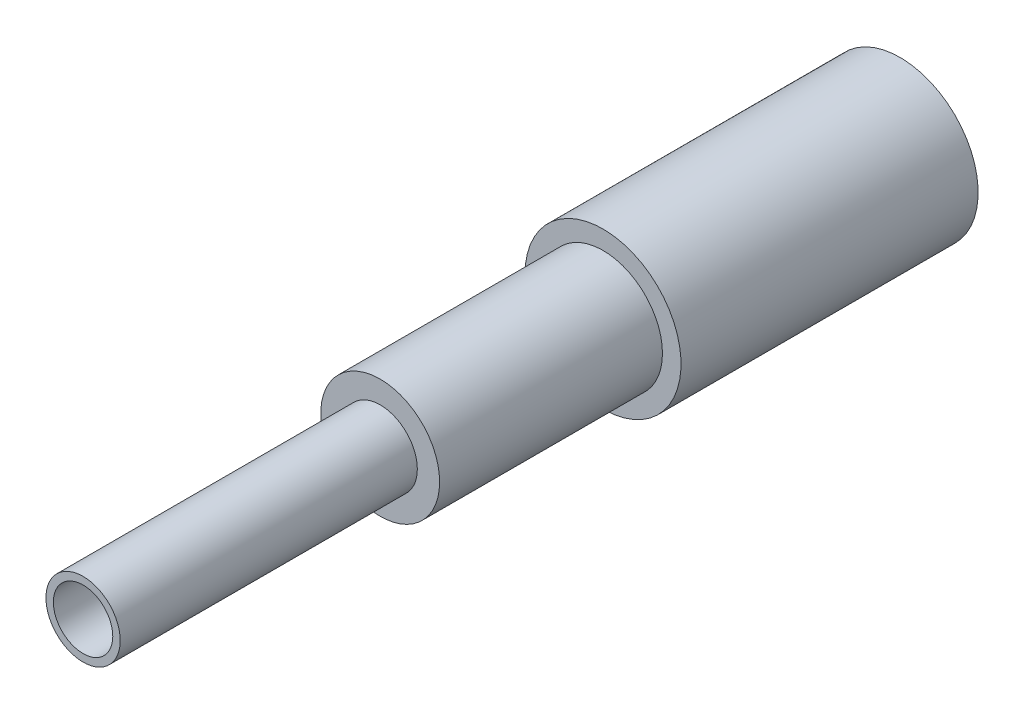
ISO-10303-21;
HEADER;
FILE_DESCRIPTION(('STEP AP214'),'2;1');
FILE_NAME('part.step','',(''),(''),'','','');
FILE_SCHEMA(('AUTOMOTIVE_DESIGN { 1 0 10303 214 1 1 1 1 }'));
ENDSEC;
DATA;
#1=APPLICATION_CONTEXT('core data for automotive mechanical design processes');
#2=APPLICATION_PROTOCOL_DEFINITION('international standard','automotive_design',2000,#1);
#3=PRODUCT_CONTEXT('',#1,'mechanical');
#4=PRODUCT('Part','Part','',(#3));
#5=PRODUCT_RELATED_PRODUCT_CATEGORY('part','',(#4));
#6=PRODUCT_DEFINITION_FORMATION('','',#4);
#7=PRODUCT_DEFINITION_CONTEXT('part definition',#1,'design');
#8=PRODUCT_DEFINITION('design','',#6,#7);
#9=PRODUCT_DEFINITION_SHAPE('','',#8);
#10=(LENGTH_UNIT() NAMED_UNIT(*) SI_UNIT(.MILLI.,.METRE.));
#11=(NAMED_UNIT(*) PLANE_ANGLE_UNIT() SI_UNIT($,.RADIAN.));
#12=(NAMED_UNIT(*) SI_UNIT($,.STERADIAN.) SOLID_ANGLE_UNIT());
#13=UNCERTAINTY_MEASURE_WITH_UNIT(LENGTH_MEASURE(1.E-05),#10,'distance_accuracy_value','');
#14=(GEOMETRIC_REPRESENTATION_CONTEXT(3) GLOBAL_UNCERTAINTY_ASSIGNED_CONTEXT((#13)) GLOBAL_UNIT_ASSIGNED_CONTEXT((#10,
#11,#12)) REPRESENTATION_CONTEXT('',''));
#15=CARTESIAN_POINT('',(0.,0.,0.));
#16=DIRECTION('',(0.,0.,1.));
#17=DIRECTION('',(1.,0.,0.));
#18=AXIS2_PLACEMENT_3D('',#15,#16,#17);
#19=CARTESIAN_POINT('',(0.,0.,30.));
#20=DIRECTION('',(0.,0.,-1.));
#21=DIRECTION('',(-1.,0.,0.));
#22=AXIS2_PLACEMENT_3D('',#19,#20,#21);
#23=CYLINDRICAL_SURFACE('',#22,8.);
#24=CARTESIAN_POINT('',(0.,0.,30.));
#25=DIRECTION('',(0.,0.,1.));
#26=DIRECTION('',(1.,0.,0.));
#27=AXIS2_PLACEMENT_3D('',#24,#25,#26);
#28=CIRCLE('',#27,8.);
#29=CARTESIAN_POINT('',(8.,0.,30.));
#30=VERTEX_POINT('',#29);
#31=EDGE_CURVE('E44',#30,#30,#28,.T.);
#32=ORIENTED_EDGE('',*,*,#31,.F.);
#33=EDGE_LOOP('',(#32));
#34=FACE_BOUND('',#33,.T.);
#35=CARTESIAN_POINT('',(0.,0.,0.));
#36=DIRECTION('',(0.,0.,1.));
#37=DIRECTION('',(1.,0.,0.));
#38=AXIS2_PLACEMENT_3D('',#35,#36,#37);
#39=CIRCLE('',#38,8.);
#40=CARTESIAN_POINT('',(8.,0.,0.));
#41=VERTEX_POINT('',#40);
#42=EDGE_CURVE('E40',#41,#41,#39,.T.);
#43=ORIENTED_EDGE('',*,*,#42,.T.);
#44=EDGE_LOOP('',(#43));
#45=FACE_BOUND('',#44,.T.);
#46=ADVANCED_FACE('F37',(#34,#45),#23,.T.);
#47=CARTESIAN_POINT('',(0.,0.,30.));
#48=DIRECTION('',(0.,0.,1.));
#49=DIRECTION('',(1.,0.,0.));
#50=AXIS2_PLACEMENT_3D('',#47,#48,#49);
#51=PLANE('',#50);
#52=CARTESIAN_POINT('',(0.,0.,30.));
#53=DIRECTION('',(0.,0.,1.));
#54=DIRECTION('',(1.,0.,0.));
#55=AXIS2_PLACEMENT_3D('',#52,#53,#54);
#56=CIRCLE('',#55,5.);
#57=CARTESIAN_POINT('',(5.,0.,30.));
#58=VERTEX_POINT('',#57);
#59=EDGE_CURVE('E10',#58,#58,#56,.T.);
#60=ORIENTED_EDGE('',*,*,#59,.F.);
#61=EDGE_LOOP('',(#60));
#62=FACE_BOUND('',#61,.T.);
#63=ORIENTED_EDGE('',*,*,#31,.T.);
#64=EDGE_LOOP('',(#63));
#65=FACE_BOUND('',#64,.T.);
#66=ADVANCED_FACE('F106',(#62,#65),#51,.T.);
#67=CARTESIAN_POINT('',(0.,0.,70.));
#68=DIRECTION('',(0.,0.,-1.));
#69=DIRECTION('',(-1.,0.,0.));
#70=AXIS2_PLACEMENT_3D('',#67,#68,#69);
#71=CYLINDRICAL_SURFACE('',#70,5.);
#72=CARTESIAN_POINT('',(0.,0.,70.));
#73=DIRECTION('',(0.,0.,1.));
#74=DIRECTION('',(1.,0.,0.));
#75=AXIS2_PLACEMENT_3D('',#72,#73,#74);
#76=CIRCLE('',#75,5.);
#77=CARTESIAN_POINT('',(5.,0.,70.));
#78=VERTEX_POINT('',#77);
#79=EDGE_CURVE('E49',#78,#78,#76,.T.);
#80=ORIENTED_EDGE('',*,*,#79,.F.);
#81=EDGE_LOOP('',(#80));
#82=FACE_BOUND('',#81,.T.);
#83=ORIENTED_EDGE('',*,*,#59,.T.);
#84=EDGE_LOOP('',(#83));
#85=FACE_BOUND('',#84,.T.);
#86=ADVANCED_FACE('F111',(#82,#85),#71,.T.);
#87=CARTESIAN_POINT('',(0.,0.,70.));
#88=DIRECTION('',(0.,0.,1.));
#89=DIRECTION('',(1.,0.,0.));
#90=AXIS2_PLACEMENT_3D('',#87,#88,#89);
#91=PLANE('',#90);
#92=CARTESIAN_POINT('',(0.,0.,70.));
#93=DIRECTION('',(0.,0.,1.));
#94=DIRECTION('',(1.,0.,0.));
#95=AXIS2_PLACEMENT_3D('',#92,#93,#94);
#96=CIRCLE('',#95,4.);
#97=CARTESIAN_POINT('',(4.,0.,70.));
#98=VERTEX_POINT('',#97);
#99=EDGE_CURVE('E60',#98,#98,#96,.T.);
#100=ORIENTED_EDGE('',*,*,#99,.F.);
#101=EDGE_LOOP('',(#100));
#102=FACE_BOUND('',#101,.T.);
#103=ORIENTED_EDGE('',*,*,#79,.T.);
#104=EDGE_LOOP('',(#103));
#105=FACE_BOUND('',#104,.T.);
#106=ADVANCED_FACE('F90',(#102,#105),#91,.T.);
#107=CARTESIAN_POINT('',(0.,0.,-40.));
#108=DIRECTION('',(0.,0.,1.));
#109=DIRECTION('',(1.,0.,0.));
#110=AXIS2_PLACEMENT_3D('',#107,#108,#109);
#111=CYLINDRICAL_SURFACE('',#110,10.5);
#112=CARTESIAN_POINT('',(0.,0.,-40.));
#113=DIRECTION('',(0.,0.,-1.));
#114=DIRECTION('',(-1.,0.,0.));
#115=AXIS2_PLACEMENT_3D('',#112,#113,#114);
#116=CIRCLE('',#115,10.5);
#117=CARTESIAN_POINT('',(-10.5,0.,-40.));
#118=VERTEX_POINT('',#117);
#119=EDGE_CURVE('E56',#118,#118,#116,.T.);
#120=ORIENTED_EDGE('',*,*,#119,.F.);
#121=EDGE_LOOP('',(#120));
#122=FACE_BOUND('',#121,.T.);
#123=CARTESIAN_POINT('',(0.,0.,0.));
#124=DIRECTION('',(0.,0.,-1.));
#125=DIRECTION('',(-1.,0.,0.));
#126=AXIS2_PLACEMENT_3D('',#123,#124,#125);
#127=CIRCLE('',#126,10.5);
#128=CARTESIAN_POINT('',(-10.5,0.,0.));
#129=VERTEX_POINT('',#128);
#130=EDGE_CURVE('E53',#129,#129,#127,.T.);
#131=ORIENTED_EDGE('',*,*,#130,.T.);
#132=EDGE_LOOP('',(#131));
#133=FACE_BOUND('',#132,.T.);
#134=ADVANCED_FACE('F84',(#122,#133),#111,.T.);
#135=CARTESIAN_POINT('',(0.,0.,-40.));
#136=DIRECTION('',(0.,0.,-1.));
#137=DIRECTION('',(-1.,0.,0.));
#138=AXIS2_PLACEMENT_3D('',#135,#136,#137);
#139=PLANE('',#138);
#140=CARTESIAN_POINT('',(0.,0.,-40.));
#141=DIRECTION('',(0.,0.,-1.));
#142=DIRECTION('',(-1.,0.,0.));
#143=AXIS2_PLACEMENT_3D('',#140,#141,#142);
#144=CIRCLE('',#143,9.5);
#145=CARTESIAN_POINT('',(-9.5,0.,-40.));
#146=VERTEX_POINT('',#145);
#147=EDGE_CURVE('E68',#146,#146,#144,.T.);
#148=ORIENTED_EDGE('',*,*,#147,.F.);
#149=EDGE_LOOP('',(#148));
#150=FACE_BOUND('',#149,.T.);
#151=ORIENTED_EDGE('',*,*,#119,.T.);
#152=EDGE_LOOP('',(#151));
#153=FACE_BOUND('',#152,.T.);
#154=ADVANCED_FACE('F80',(#150,#153),#139,.T.);
#155=CARTESIAN_POINT('',(0.,0.,0.));
#156=DIRECTION('',(0.,0.,-1.));
#157=DIRECTION('',(-1.,0.,0.));
#158=AXIS2_PLACEMENT_3D('',#155,#156,#157);
#159=PLANE('',#158);
#160=ORIENTED_EDGE('',*,*,#42,.F.);
#161=EDGE_LOOP('',(#160));
#162=FACE_BOUND('',#161,.T.);
#163=ORIENTED_EDGE('',*,*,#130,.F.);
#164=EDGE_LOOP('',(#163));
#165=FACE_BOUND('',#164,.T.);
#166=ADVANCED_FACE('F83',(#162,#165),#159,.F.);
#167=CARTESIAN_POINT('',(0.,0.,30.));
#168=DIRECTION('',(0.,0.,-1.));
#169=DIRECTION('',(-1.,0.,0.));
#170=AXIS2_PLACEMENT_3D('',#167,#168,#169);
#171=CYLINDRICAL_SURFACE('',#170,7.);
#172=CARTESIAN_POINT('',(0.,0.,29.));
#173=DIRECTION('',(0.,0.,1.));
#174=DIRECTION('',(1.,0.,0.));
#175=AXIS2_PLACEMENT_3D('',#172,#173,#174);
#176=CIRCLE('',#175,7.);
#177=CARTESIAN_POINT('',(7.,0.,29.));
#178=VERTEX_POINT('',#177);
#179=EDGE_CURVE('E63',#178,#178,#176,.T.);
#180=ORIENTED_EDGE('',*,*,#179,.T.);
#181=EDGE_LOOP('',(#180));
#182=FACE_BOUND('',#181,.T.);
#183=CARTESIAN_POINT('',(0.,0.,-1.));
#184=DIRECTION('',(0.,0.,-1.));
#185=DIRECTION('',(-1.,0.,0.));
#186=AXIS2_PLACEMENT_3D('',#183,#184,#185);
#187=CIRCLE('',#186,7.);
#188=CARTESIAN_POINT('',(-7.,0.,-1.));
#189=VERTEX_POINT('',#188);
#190=EDGE_CURVE('E64',#189,#189,#187,.F.);
#191=ORIENTED_EDGE('',*,*,#190,.F.);
#192=EDGE_LOOP('',(#191));
#193=FACE_BOUND('',#192,.T.);
#194=ADVANCED_FACE('F95',(#182,#193),#171,.F.);
#195=CARTESIAN_POINT('',(0.,0.,29.));
#196=DIRECTION('',(0.,0.,1.));
#197=DIRECTION('',(1.,0.,0.));
#198=AXIS2_PLACEMENT_3D('',#195,#196,#197);
#199=PLANE('',#198);
#200=CARTESIAN_POINT('',(0.,0.,29.));
#201=DIRECTION('',(0.,0.,1.));
#202=DIRECTION('',(1.,0.,0.));
#203=AXIS2_PLACEMENT_3D('',#200,#201,#202);
#204=CIRCLE('',#203,4.);
#205=CARTESIAN_POINT('',(4.,0.,29.));
#206=VERTEX_POINT('',#205);
#207=EDGE_CURVE('E57',#206,#206,#204,.T.);
#208=ORIENTED_EDGE('',*,*,#207,.T.);
#209=EDGE_LOOP('',(#208));
#210=FACE_BOUND('',#209,.T.);
#211=ORIENTED_EDGE('',*,*,#179,.F.);
#212=EDGE_LOOP('',(#211));
#213=FACE_BOUND('',#212,.T.);
#214=ADVANCED_FACE('F101',(#210,#213),#199,.F.);
#215=CARTESIAN_POINT('',(0.,0.,70.));
#216=DIRECTION('',(0.,0.,-1.));
#217=DIRECTION('',(-1.,0.,0.));
#218=AXIS2_PLACEMENT_3D('',#215,#216,#217);
#219=CYLINDRICAL_SURFACE('',#218,4.);
#220=ORIENTED_EDGE('',*,*,#99,.T.);
#221=EDGE_LOOP('',(#220));
#222=FACE_BOUND('',#221,.T.);
#223=ORIENTED_EDGE('',*,*,#207,.F.);
#224=EDGE_LOOP('',(#223));
#225=FACE_BOUND('',#224,.T.);
#226=ADVANCED_FACE('F131',(#222,#225),#219,.F.);
#227=CARTESIAN_POINT('',(0.,0.,-40.));
#228=DIRECTION('',(0.,0.,1.));
#229=DIRECTION('',(1.,0.,0.));
#230=AXIS2_PLACEMENT_3D('',#227,#228,#229);
#231=CYLINDRICAL_SURFACE('',#230,9.5);
#232=CARTESIAN_POINT('',(0.,0.,-1.));
#233=DIRECTION('',(0.,0.,-1.));
#234=DIRECTION('',(-1.,0.,0.));
#235=AXIS2_PLACEMENT_3D('',#232,#233,#234);
#236=CIRCLE('',#235,9.5);
#237=CARTESIAN_POINT('',(-9.5,0.,-1.));
#238=VERTEX_POINT('',#237);
#239=EDGE_CURVE('E65',#238,#238,#236,.T.);
#240=ORIENTED_EDGE('',*,*,#239,.F.);
#241=EDGE_LOOP('',(#240));
#242=FACE_BOUND('',#241,.T.);
#243=ORIENTED_EDGE('',*,*,#147,.T.);
#244=EDGE_LOOP('',(#243));
#245=FACE_BOUND('',#244,.T.);
#246=ADVANCED_FACE('F78',(#242,#245),#231,.F.);
#247=CARTESIAN_POINT('',(0.,0.,-1.));
#248=DIRECTION('',(0.,0.,-1.));
#249=DIRECTION('',(-1.,0.,0.));
#250=AXIS2_PLACEMENT_3D('',#247,#248,#249);
#251=PLANE('',#250);
#252=ORIENTED_EDGE('',*,*,#190,.T.);
#253=EDGE_LOOP('',(#252));
#254=FACE_BOUND('',#253,.T.);
#255=ORIENTED_EDGE('',*,*,#239,.T.);
#256=EDGE_LOOP('',(#255));
#257=FACE_BOUND('',#256,.T.);
#258=ADVANCED_FACE('F144',(#254,#257),#251,.T.);
#259=CLOSED_SHELL('',(#46,#66,#86,#106,#134,#154,#166,#194,#214,#226,#246,#258));
#260=MANIFOLD_SOLID_BREP('B2',#259);
#261=ADVANCED_BREP_SHAPE_REPRESENTATION('',(#18,#260),#14);
#262=SHAPE_DEFINITION_REPRESENTATION(#9,#261);
ENDSEC;
END-ISO-10303-21;
